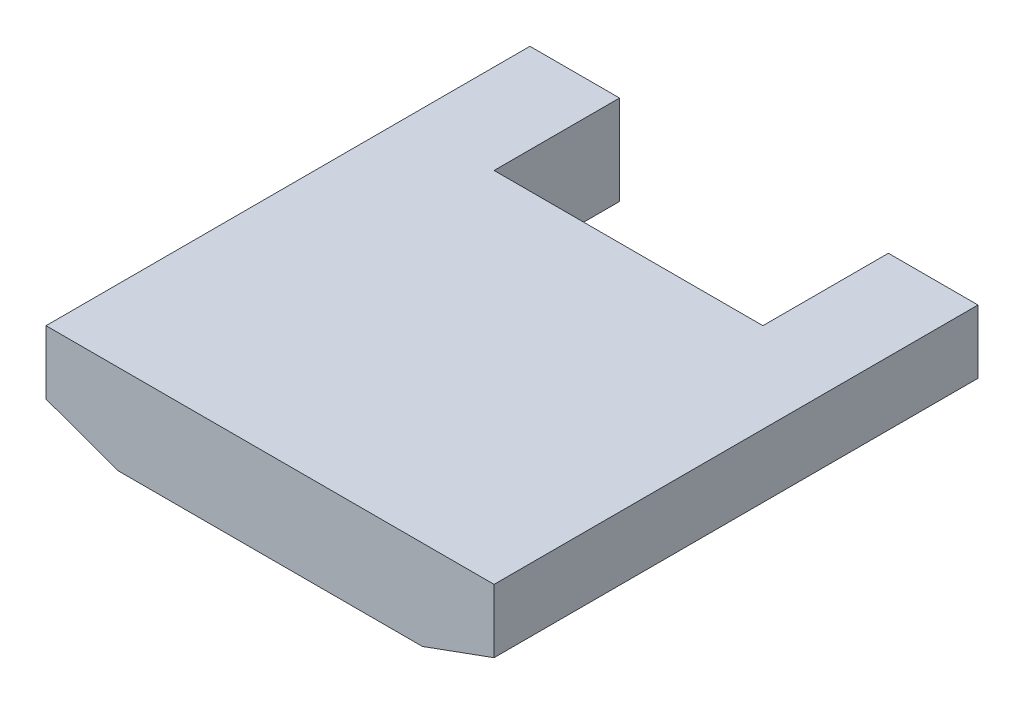
ISO-10303-21;
HEADER;
FILE_DESCRIPTION(('STEP AP214'),'2;1');
FILE_NAME('part.step','',(''),(''),'','','');
FILE_SCHEMA(('AUTOMOTIVE_DESIGN { 1 0 10303 214 1 1 1 1 }'));
ENDSEC;
DATA;
#1=APPLICATION_CONTEXT('core data for automotive mechanical design processes');
#2=APPLICATION_PROTOCOL_DEFINITION('international standard','automotive_design',2000,#1);
#3=PRODUCT_CONTEXT('',#1,'mechanical');
#4=PRODUCT('Part','Part','',(#3));
#5=PRODUCT_RELATED_PRODUCT_CATEGORY('part','',(#4));
#6=PRODUCT_DEFINITION_FORMATION('','',#4);
#7=PRODUCT_DEFINITION_CONTEXT('part definition',#1,'design');
#8=PRODUCT_DEFINITION('design','',#6,#7);
#9=PRODUCT_DEFINITION_SHAPE('','',#8);
#10=(LENGTH_UNIT() NAMED_UNIT(*) SI_UNIT(.MILLI.,.METRE.));
#11=(NAMED_UNIT(*) PLANE_ANGLE_UNIT() SI_UNIT($,.RADIAN.));
#12=(NAMED_UNIT(*) SI_UNIT($,.STERADIAN.) SOLID_ANGLE_UNIT());
#13=UNCERTAINTY_MEASURE_WITH_UNIT(LENGTH_MEASURE(1.E-05),#10,'distance_accuracy_value','');
#14=(GEOMETRIC_REPRESENTATION_CONTEXT(3) GLOBAL_UNCERTAINTY_ASSIGNED_CONTEXT((#13)) GLOBAL_UNIT_ASSIGNED_CONTEXT((#10,
#11,#12)) REPRESENTATION_CONTEXT('',''));
#15=CARTESIAN_POINT('',(0.,0.,0.));
#16=DIRECTION('',(0.,0.,1.));
#17=DIRECTION('',(1.,0.,0.));
#18=AXIS2_PLACEMENT_3D('',#15,#16,#17);
#19=CARTESIAN_POINT('',(0.,12.7,-68.58));
#20=DIRECTION('',(1.,0.,0.));
#21=DIRECTION('',(0.,0.,-1.));
#22=AXIS2_PLACEMENT_3D('',#19,#20,#21);
#23=PLANE('',#22);
#24=DIRECTION('',(0.,-1.,0.));
#25=VECTOR('',#24,1.);
#26=CARTESIAN_POINT('',(0.,12.7,-68.58));
#27=LINE('',#26,#25);
#28=CARTESIAN_POINT('',(0.,12.7,-68.58));
#29=VERTEX_POINT('',#28);
#30=CARTESIAN_POINT('',(0.,3.69793758014463,-68.58));
#31=VERTEX_POINT('',#30);
#32=EDGE_CURVE('E168',#29,#31,#27,.T.);
#33=ORIENTED_EDGE('',*,*,#32,.T.);
#34=DIRECTION('',(0.,0.,1.));
#35=VECTOR('',#34,1.);
#36=CARTESIAN_POINT('',(0.,3.69793758014463,-68.58));
#37=LINE('',#36,#35);
#38=CARTESIAN_POINT('',(0.,3.69793758014463,0.));
#39=VERTEX_POINT('',#38);
#40=EDGE_CURVE('E131',#31,#39,#37,.T.);
#41=ORIENTED_EDGE('',*,*,#40,.T.);
#42=DIRECTION('',(0.,-1.,0.));
#43=VECTOR('',#42,1.);
#44=CARTESIAN_POINT('',(0.,12.7,0.));
#45=LINE('',#44,#43);
#46=CARTESIAN_POINT('',(0.,12.7,0.));
#47=VERTEX_POINT('',#46);
#48=EDGE_CURVE('E112',#47,#39,#45,.T.);
#49=ORIENTED_EDGE('',*,*,#48,.F.);
#50=DIRECTION('',(0.,0.,1.));
#51=VECTOR('',#50,1.);
#52=CARTESIAN_POINT('',(0.,12.7,-68.58));
#53=LINE('',#52,#51);
#54=EDGE_CURVE('E118',#29,#47,#53,.T.);
#55=ORIENTED_EDGE('',*,*,#54,.F.);
#56=EDGE_LOOP('',(#33,#41,#49,#55));
#57=FACE_BOUND('',#56,.T.);
#58=ADVANCED_FACE('F33',(#57),#23,.F.);
#59=CARTESIAN_POINT('',(0.,12.7,0.));
#60=DIRECTION('',(0.,0.,-1.));
#61=DIRECTION('',(-1.,0.,0.));
#62=AXIS2_PLACEMENT_3D('',#59,#60,#61);
#63=PLANE('',#62);
#64=ORIENTED_EDGE('',*,*,#48,.T.);
#65=DIRECTION('',(-0.939692620785909,0.342020143325667,0.));
#66=VECTOR('',#65,1.);
#67=CARTESIAN_POINT('',(0.,3.69793758014463,0.));
#68=LINE('',#67,#66);
#69=CARTESIAN_POINT('',(10.1600000000001,0.,0.));
#70=VERTEX_POINT('',#69);
#71=EDGE_CURVE('E140',#39,#70,#68,.F.);
#72=ORIENTED_EDGE('',*,*,#71,.T.);
#73=DIRECTION('',(1.,0.,0.));
#74=VECTOR('',#73,1.);
#75=CARTESIAN_POINT('',(0.,0.,0.));
#76=LINE('',#75,#74);
#77=CARTESIAN_POINT('',(53.3399999999997,0.,0.));
#78=VERTEX_POINT('',#77);
#79=EDGE_CURVE('E180',#70,#78,#76,.T.);
#80=ORIENTED_EDGE('',*,*,#79,.T.);
#81=DIRECTION('',(-0.939692620785909,-0.342020143325667,0.));
#82=VECTOR('',#81,1.);
#83=CARTESIAN_POINT('',(63.5,3.69793758014463,0.));
#84=LINE('',#83,#82);
#85=CARTESIAN_POINT('',(63.5,3.69793758014463,0.));
#86=VERTEX_POINT('',#85);
#87=EDGE_CURVE('E133',#78,#86,#84,.F.);
#88=ORIENTED_EDGE('',*,*,#87,.T.);
#89=DIRECTION('',(0.,-1.,0.));
#90=VECTOR('',#89,1.);
#91=CARTESIAN_POINT('',(63.5,12.7,0.));
#92=LINE('',#91,#90);
#93=CARTESIAN_POINT('',(63.5,12.7,0.));
#94=VERTEX_POINT('',#93);
#95=EDGE_CURVE('E114',#94,#86,#92,.T.);
#96=ORIENTED_EDGE('',*,*,#95,.F.);
#97=DIRECTION('',(1.,0.,0.));
#98=VECTOR('',#97,1.);
#99=CARTESIAN_POINT('',(0.,12.7,0.));
#100=LINE('',#99,#98);
#101=EDGE_CURVE('E108',#47,#94,#100,.T.);
#102=ORIENTED_EDGE('',*,*,#101,.F.);
#103=EDGE_LOOP('',(#64,#72,#80,#88,#96,#102));
#104=FACE_BOUND('',#103,.T.);
#105=ADVANCED_FACE('F110',(#104),#63,.F.);
#106=CARTESIAN_POINT('',(63.5,12.7,0.));
#107=DIRECTION('',(-1.,0.,0.));
#108=DIRECTION('',(0.,0.,1.));
#109=AXIS2_PLACEMENT_3D('',#106,#107,#108);
#110=PLANE('',#109);
#111=ORIENTED_EDGE('',*,*,#95,.T.);
#112=DIRECTION('',(0.,0.,-1.));
#113=VECTOR('',#112,1.);
#114=CARTESIAN_POINT('',(63.5,3.69793758014463,0.));
#115=LINE('',#114,#113);
#116=CARTESIAN_POINT('',(63.5,3.69793758014462,-68.58));
#117=VERTEX_POINT('',#116);
#118=EDGE_CURVE('E41',#86,#117,#115,.T.);
#119=ORIENTED_EDGE('',*,*,#118,.T.);
#120=DIRECTION('',(0.,-1.,0.));
#121=VECTOR('',#120,1.);
#122=CARTESIAN_POINT('',(63.5,12.7,-68.58));
#123=LINE('',#122,#121);
#124=CARTESIAN_POINT('',(63.5,12.7,-68.58));
#125=VERTEX_POINT('',#124);
#126=EDGE_CURVE('E135',#125,#117,#123,.T.);
#127=ORIENTED_EDGE('',*,*,#126,.F.);
#128=DIRECTION('',(0.,0.,-1.));
#129=VECTOR('',#128,1.);
#130=CARTESIAN_POINT('',(63.5,12.7,0.));
#131=LINE('',#130,#129);
#132=EDGE_CURVE('E117',#94,#125,#131,.T.);
#133=ORIENTED_EDGE('',*,*,#132,.F.);
#134=EDGE_LOOP('',(#111,#119,#127,#133));
#135=FACE_BOUND('',#134,.T.);
#136=ADVANCED_FACE('F149',(#135),#110,.F.);
#137=CARTESIAN_POINT('',(63.5,12.7,-68.58));
#138=DIRECTION('',(0.,0.,1.));
#139=DIRECTION('',(1.,0.,0.));
#140=AXIS2_PLACEMENT_3D('',#137,#138,#139);
#141=PLANE('',#140);
#142=ORIENTED_EDGE('',*,*,#126,.T.);
#143=DIRECTION('',(0.939692620785909,0.342020143325667,0.));
#144=VECTOR('',#143,1.);
#145=CARTESIAN_POINT('',(63.5,3.69793758014465,-68.58));
#146=LINE('',#145,#144);
#147=CARTESIAN_POINT('',(53.3399999999999,0.,-68.58));
#148=VERTEX_POINT('',#147);
#149=EDGE_CURVE('E11',#117,#148,#146,.F.);
#150=ORIENTED_EDGE('',*,*,#149,.T.);
#151=DIRECTION('',(-1.,0.,0.));
#152=VECTOR('',#151,1.);
#153=CARTESIAN_POINT('',(63.5,0.,-68.58));
#154=LINE('',#153,#152);
#155=CARTESIAN_POINT('',(50.8,0.,-68.58));
#156=VERTEX_POINT('',#155);
#157=EDGE_CURVE('E178',#148,#156,#154,.T.);
#158=ORIENTED_EDGE('',*,*,#157,.T.);
#159=DIRECTION('',(0.,-1.,0.));
#160=VECTOR('',#159,1.);
#161=CARTESIAN_POINT('',(50.8,12.7,-68.58));
#162=LINE('',#161,#160);
#163=CARTESIAN_POINT('',(50.8,12.7,-68.58));
#164=VERTEX_POINT('',#163);
#165=EDGE_CURVE('E155',#164,#156,#162,.T.);
#166=ORIENTED_EDGE('',*,*,#165,.F.);
#167=DIRECTION('',(-1.,0.,0.));
#168=VECTOR('',#167,1.);
#169=CARTESIAN_POINT('',(63.5,12.7,-68.58));
#170=LINE('',#169,#168);
#171=EDGE_CURVE('E154',#125,#164,#170,.T.);
#172=ORIENTED_EDGE('',*,*,#171,.F.);
#173=EDGE_LOOP('',(#142,#150,#158,#166,#172));
#174=FACE_BOUND('',#173,.T.);
#175=ADVANCED_FACE('F152',(#174),#141,.F.);
#176=CARTESIAN_POINT('',(50.8,12.7,-68.58));
#177=DIRECTION('',(1.,0.,0.));
#178=DIRECTION('',(0.,0.,-1.));
#179=AXIS2_PLACEMENT_3D('',#176,#177,#178);
#180=PLANE('',#179);
#181=DIRECTION('',(0.,0.,1.));
#182=VECTOR('',#181,1.);
#183=CARTESIAN_POINT('',(50.8,0.,-68.58));
#184=LINE('',#183,#182);
#185=CARTESIAN_POINT('',(50.8,0.,-50.8));
#186=VERTEX_POINT('',#185);
#187=EDGE_CURVE('E176',#156,#186,#184,.T.);
#188=ORIENTED_EDGE('',*,*,#187,.T.);
#189=DIRECTION('',(0.,-1.,0.));
#190=VECTOR('',#189,1.);
#191=CARTESIAN_POINT('',(50.8,12.7,-50.8));
#192=LINE('',#191,#190);
#193=CARTESIAN_POINT('',(50.8,12.7,-50.8));
#194=VERTEX_POINT('',#193);
#195=EDGE_CURVE('E157',#194,#186,#192,.T.);
#196=ORIENTED_EDGE('',*,*,#195,.F.);
#197=DIRECTION('',(0.,0.,1.));
#198=VECTOR('',#197,1.);
#199=CARTESIAN_POINT('',(50.8,12.7,-68.58));
#200=LINE('',#199,#198);
#201=EDGE_CURVE('E188',#164,#194,#200,.T.);
#202=ORIENTED_EDGE('',*,*,#201,.F.);
#203=ORIENTED_EDGE('',*,*,#165,.T.);
#204=EDGE_LOOP('',(#188,#196,#202,#203));
#205=FACE_BOUND('',#204,.T.);
#206=ADVANCED_FACE('F195',(#205),#180,.F.);
#207=CARTESIAN_POINT('',(50.8,12.7,-50.8));
#208=DIRECTION('',(0.,0.,1.));
#209=DIRECTION('',(1.,0.,0.));
#210=AXIS2_PLACEMENT_3D('',#207,#208,#209);
#211=PLANE('',#210);
#212=DIRECTION('',(-1.,0.,0.));
#213=VECTOR('',#212,1.);
#214=CARTESIAN_POINT('',(50.8,0.,-50.8));
#215=LINE('',#214,#213);
#216=CARTESIAN_POINT('',(12.7,0.,-50.8));
#217=VERTEX_POINT('',#216);
#218=EDGE_CURVE('E174',#186,#217,#215,.T.);
#219=ORIENTED_EDGE('',*,*,#218,.T.);
#220=DIRECTION('',(0.,-1.,0.));
#221=VECTOR('',#220,1.);
#222=CARTESIAN_POINT('',(12.7,12.7,-50.8));
#223=LINE('',#222,#221);
#224=CARTESIAN_POINT('',(12.7,12.7,-50.8));
#225=VERTEX_POINT('',#224);
#226=EDGE_CURVE('E162',#225,#217,#223,.T.);
#227=ORIENTED_EDGE('',*,*,#226,.F.);
#228=DIRECTION('',(-1.,0.,0.));
#229=VECTOR('',#228,1.);
#230=CARTESIAN_POINT('',(50.8,12.7,-50.8));
#231=LINE('',#230,#229);
#232=EDGE_CURVE('E186',#194,#225,#231,.T.);
#233=ORIENTED_EDGE('',*,*,#232,.F.);
#234=ORIENTED_EDGE('',*,*,#195,.T.);
#235=EDGE_LOOP('',(#219,#227,#233,#234));
#236=FACE_BOUND('',#235,.T.);
#237=ADVANCED_FACE('F200',(#236),#211,.F.);
#238=CARTESIAN_POINT('',(12.7,12.7,-50.8));
#239=DIRECTION('',(-1.,0.,0.));
#240=DIRECTION('',(0.,0.,1.));
#241=AXIS2_PLACEMENT_3D('',#238,#239,#240);
#242=PLANE('',#241);
#243=DIRECTION('',(0.,0.,-1.));
#244=VECTOR('',#243,1.);
#245=CARTESIAN_POINT('',(12.7,0.,-50.8));
#246=LINE('',#245,#244);
#247=CARTESIAN_POINT('',(12.7,0.,-68.58));
#248=VERTEX_POINT('',#247);
#249=EDGE_CURVE('E172',#217,#248,#246,.T.);
#250=ORIENTED_EDGE('',*,*,#249,.T.);
#251=DIRECTION('',(0.,-1.,0.));
#252=VECTOR('',#251,1.);
#253=CARTESIAN_POINT('',(12.7,12.7,-68.58));
#254=LINE('',#253,#252);
#255=CARTESIAN_POINT('',(12.7,12.7,-68.58));
#256=VERTEX_POINT('',#255);
#257=EDGE_CURVE('E165',#256,#248,#254,.T.);
#258=ORIENTED_EDGE('',*,*,#257,.F.);
#259=DIRECTION('',(0.,0.,-1.));
#260=VECTOR('',#259,1.);
#261=CARTESIAN_POINT('',(12.7,12.7,-50.8));
#262=LINE('',#261,#260);
#263=EDGE_CURVE('E184',#225,#256,#262,.T.);
#264=ORIENTED_EDGE('',*,*,#263,.F.);
#265=ORIENTED_EDGE('',*,*,#226,.T.);
#266=EDGE_LOOP('',(#250,#258,#264,#265));
#267=FACE_BOUND('',#266,.T.);
#268=ADVANCED_FACE('F204',(#267),#242,.F.);
#269=CARTESIAN_POINT('',(12.7,12.7,-68.58));
#270=DIRECTION('',(0.,0.,1.));
#271=DIRECTION('',(1.,0.,0.));
#272=AXIS2_PLACEMENT_3D('',#269,#270,#271);
#273=PLANE('',#272);
#274=DIRECTION('',(-1.,0.,0.));
#275=VECTOR('',#274,1.);
#276=CARTESIAN_POINT('',(12.7,0.,-68.58));
#277=LINE('',#276,#275);
#278=CARTESIAN_POINT('',(10.1600000000001,0.,-68.58));
#279=VERTEX_POINT('',#278);
#280=EDGE_CURVE('E127',#248,#279,#277,.T.);
#281=ORIENTED_EDGE('',*,*,#280,.T.);
#282=DIRECTION('',(0.939692620785909,-0.342020143325667,0.));
#283=VECTOR('',#282,1.);
#284=CARTESIAN_POINT('',(0.,3.69793758014463,-68.58));
#285=LINE('',#284,#283);
#286=EDGE_CURVE('E146',#279,#31,#285,.F.);
#287=ORIENTED_EDGE('',*,*,#286,.T.);
#288=ORIENTED_EDGE('',*,*,#32,.F.);
#289=DIRECTION('',(-1.,0.,0.));
#290=VECTOR('',#289,1.);
#291=CARTESIAN_POINT('',(12.7,12.7,-68.58));
#292=LINE('',#291,#290);
#293=EDGE_CURVE('E123',#256,#29,#292,.T.);
#294=ORIENTED_EDGE('',*,*,#293,.F.);
#295=ORIENTED_EDGE('',*,*,#257,.T.);
#296=EDGE_LOOP('',(#281,#287,#288,#294,#295));
#297=FACE_BOUND('',#296,.T.);
#298=ADVANCED_FACE('F208',(#297),#273,.F.);
#299=CARTESIAN_POINT('',(0.,12.7,0.));
#300=DIRECTION('',(0.,1.,0.));
#301=DIRECTION('',(0.,0.,1.));
#302=AXIS2_PLACEMENT_3D('',#299,#300,#301);
#303=PLANE('',#302);
#304=ORIENTED_EDGE('',*,*,#54,.T.);
#305=ORIENTED_EDGE('',*,*,#101,.T.);
#306=ORIENTED_EDGE('',*,*,#132,.T.);
#307=ORIENTED_EDGE('',*,*,#171,.T.);
#308=ORIENTED_EDGE('',*,*,#201,.T.);
#309=ORIENTED_EDGE('',*,*,#232,.T.);
#310=ORIENTED_EDGE('',*,*,#263,.T.);
#311=ORIENTED_EDGE('',*,*,#293,.T.);
#312=EDGE_LOOP('',(#304,#305,#306,#307,#308,#309,#310,#311));
#313=FACE_BOUND('',#312,.T.);
#314=ADVANCED_FACE('F121',(#313),#303,.T.);
#315=CARTESIAN_POINT('',(0.,0.,0.));
#316=DIRECTION('',(0.,1.,0.));
#317=DIRECTION('',(0.,0.,1.));
#318=AXIS2_PLACEMENT_3D('',#315,#316,#317);
#319=PLANE('',#318);
#320=ORIENTED_EDGE('',*,*,#79,.F.);
#321=DIRECTION('',(0.,0.,-1.));
#322=VECTOR('',#321,1.);
#323=CARTESIAN_POINT('',(10.1600000000001,0.,0.));
#324=LINE('',#323,#322);
#325=EDGE_CURVE('E144',#70,#279,#324,.T.);
#326=ORIENTED_EDGE('',*,*,#325,.T.);
#327=ORIENTED_EDGE('',*,*,#280,.F.);
#328=ORIENTED_EDGE('',*,*,#249,.F.);
#329=ORIENTED_EDGE('',*,*,#218,.F.);
#330=ORIENTED_EDGE('',*,*,#187,.F.);
#331=ORIENTED_EDGE('',*,*,#157,.F.);
#332=DIRECTION('',(0.,0.,1.));
#333=VECTOR('',#332,1.);
#334=CARTESIAN_POINT('',(53.3399999999999,0.,0.));
#335=LINE('',#334,#333);
#336=EDGE_CURVE('E142',#148,#78,#335,.T.);
#337=ORIENTED_EDGE('',*,*,#336,.T.);
#338=EDGE_LOOP('',(#320,#326,#327,#328,#329,#330,#331,#337));
#339=FACE_BOUND('',#338,.T.);
#340=ADVANCED_FACE('F215',(#339),#319,.F.);
#341=CARTESIAN_POINT('',(0.,3.69793758014463,-68.58));
#342=DIRECTION('',(0.342020143325667,0.939692620785909,0.));
#343=DIRECTION('',(0.,0.,1.));
#344=AXIS2_PLACEMENT_3D('',#341,#342,#343);
#345=PLANE('',#344);
#346=ORIENTED_EDGE('',*,*,#286,.F.);
#347=ORIENTED_EDGE('',*,*,#325,.F.);
#348=ORIENTED_EDGE('',*,*,#71,.F.);
#349=ORIENTED_EDGE('',*,*,#40,.F.);
#350=EDGE_LOOP('',(#346,#347,#348,#349));
#351=FACE_BOUND('',#350,.T.);
#352=ADVANCED_FACE('F211',(#351),#345,.F.);
#353=CARTESIAN_POINT('',(63.5,3.69793758014463,0.));
#354=DIRECTION('',(-0.342020143325667,0.939692620785909,0.));
#355=DIRECTION('',(0.,0.,-1.));
#356=AXIS2_PLACEMENT_3D('',#353,#354,#355);
#357=PLANE('',#356);
#358=ORIENTED_EDGE('',*,*,#87,.F.);
#359=ORIENTED_EDGE('',*,*,#336,.F.);
#360=ORIENTED_EDGE('',*,*,#149,.F.);
#361=ORIENTED_EDGE('',*,*,#118,.F.);
#362=EDGE_LOOP('',(#358,#359,#360,#361));
#363=FACE_BOUND('',#362,.T.);
#364=ADVANCED_FACE('F35',(#363),#357,.F.);
#365=CLOSED_SHELL('',(#58,#105,#136,#175,#206,#237,#268,#298,#314,#340,#352,#364));
#366=MANIFOLD_SOLID_BREP('B2',#365);
#367=ADVANCED_BREP_SHAPE_REPRESENTATION('',(#18,#366),#14);
#368=SHAPE_DEFINITION_REPRESENTATION(#9,#367);
ENDSEC;
END-ISO-10303-21;
